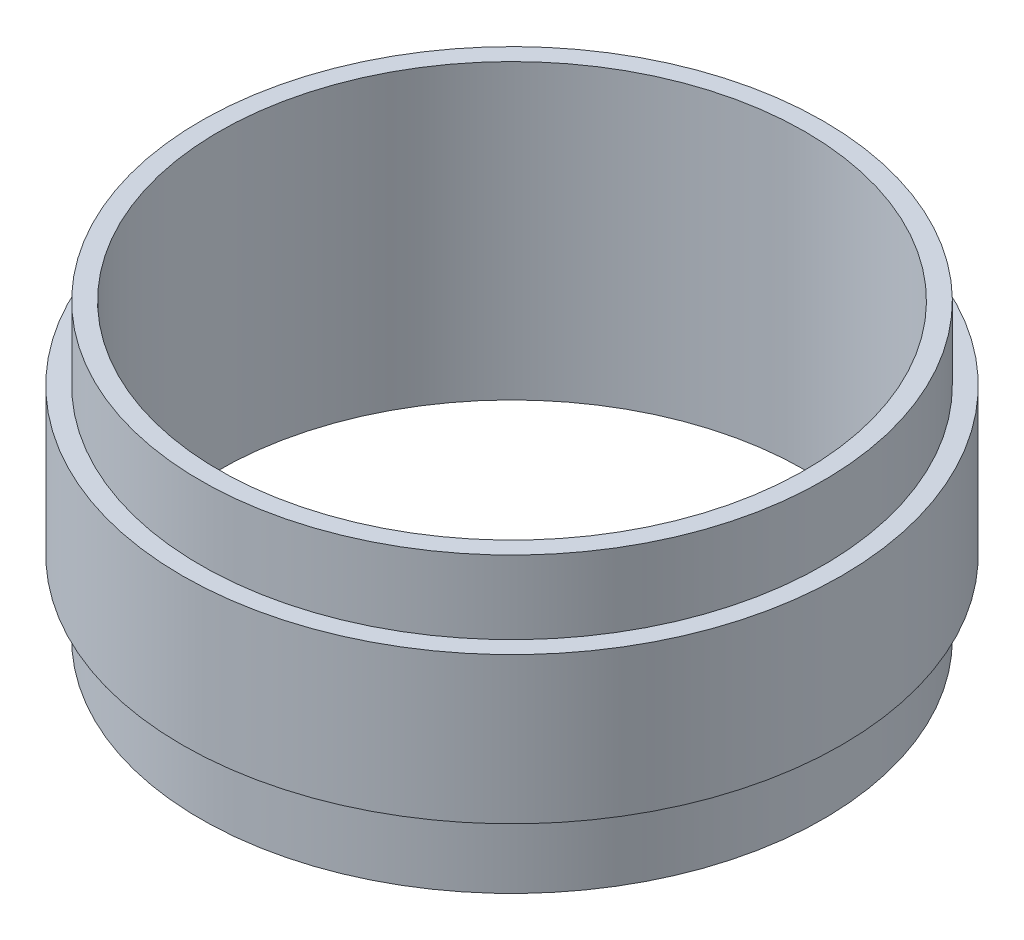
ISO-10303-21;
HEADER;
FILE_DESCRIPTION(('STEP AP214'),'2;1');
FILE_NAME('part.step','',(''),(''),'','','');
FILE_SCHEMA(('AUTOMOTIVE_DESIGN { 1 0 10303 214 1 1 1 1 }'));
ENDSEC;
DATA;
#1=APPLICATION_CONTEXT('core data for automotive mechanical design processes');
#2=APPLICATION_PROTOCOL_DEFINITION('international standard','automotive_design',2000,#1);
#3=PRODUCT_CONTEXT('',#1,'mechanical');
#4=PRODUCT('Part','Part','',(#3));
#5=PRODUCT_RELATED_PRODUCT_CATEGORY('part','',(#4));
#6=PRODUCT_DEFINITION_FORMATION('','',#4);
#7=PRODUCT_DEFINITION_CONTEXT('part definition',#1,'design');
#8=PRODUCT_DEFINITION('design','',#6,#7);
#9=PRODUCT_DEFINITION_SHAPE('','',#8);
#10=(LENGTH_UNIT() NAMED_UNIT(*) SI_UNIT(.MILLI.,.METRE.));
#11=(NAMED_UNIT(*) PLANE_ANGLE_UNIT() SI_UNIT($,.RADIAN.));
#12=(NAMED_UNIT(*) SI_UNIT($,.STERADIAN.) SOLID_ANGLE_UNIT());
#13=UNCERTAINTY_MEASURE_WITH_UNIT(LENGTH_MEASURE(1.E-05),#10,'distance_accuracy_value','');
#14=(GEOMETRIC_REPRESENTATION_CONTEXT(3) GLOBAL_UNCERTAINTY_ASSIGNED_CONTEXT((#13)) GLOBAL_UNIT_ASSIGNED_CONTEXT((#10,
#11,#12)) REPRESENTATION_CONTEXT('',''));
#15=CARTESIAN_POINT('',(0.,0.,0.));
#16=DIRECTION('',(0.,0.,1.));
#17=DIRECTION('',(1.,0.,0.));
#18=AXIS2_PLACEMENT_3D('',#15,#16,#17);
#19=CARTESIAN_POINT('',(8.5,-80.,0.));
#20=DIRECTION('',(0.,-1.,0.));
#21=DIRECTION('',(0.,0.,-1.));
#22=AXIS2_PLACEMENT_3D('',#19,#20,#21);
#23=PLANE('',#22);
#24=CARTESIAN_POINT('',(0.,-80.,0.));
#25=DIRECTION('',(0.,-1.,0.));
#26=DIRECTION('',(0.,0.,-1.));
#27=AXIS2_PLACEMENT_3D('',#24,#25,#26);
#28=CIRCLE('',#27,8.5);
#29=CARTESIAN_POINT('',(0.,-80.,-8.5));
#30=VERTEX_POINT('',#29);
#31=EDGE_CURVE('E59',#30,#30,#28,.T.);
#32=ORIENTED_EDGE('',*,*,#31,.T.);
#33=EDGE_LOOP('',(#32));
#34=FACE_BOUND('',#33,.T.);
#35=CARTESIAN_POINT('',(0.,-80.,0.));
#36=DIRECTION('',(0.,-1.,0.));
#37=DIRECTION('',(0.,0.,-1.));
#38=AXIS2_PLACEMENT_3D('',#35,#36,#37);
#39=CIRCLE('',#38,8.);
#40=CARTESIAN_POINT('',(0.,-80.,-8.));
#41=VERTEX_POINT('',#40);
#42=EDGE_CURVE('E10',#41,#41,#39,.T.);
#43=ORIENTED_EDGE('',*,*,#42,.F.);
#44=EDGE_LOOP('',(#43));
#45=FACE_BOUND('',#44,.T.);
#46=ADVANCED_FACE('F31',(#34,#45),#23,.T.);
#47=CARTESIAN_POINT('',(0.,-500.,0.));
#48=DIRECTION('',(0.,-1.,0.));
#49=DIRECTION('',(0.,0.,-1.));
#50=AXIS2_PLACEMENT_3D('',#47,#48,#49);
#51=CYLINDRICAL_SURFACE('',#50,8.);
#52=ORIENTED_EDGE('',*,*,#42,.T.);
#53=EDGE_LOOP('',(#52));
#54=FACE_BOUND('',#53,.T.);
#55=CARTESIAN_POINT('',(0.,-72.,0.));
#56=DIRECTION('',(0.,-1.,0.));
#57=DIRECTION('',(0.,0.,-1.));
#58=AXIS2_PLACEMENT_3D('',#55,#56,#57);
#59=CIRCLE('',#58,8.);
#60=CARTESIAN_POINT('',(0.,-72.,-8.));
#61=VERTEX_POINT('',#60);
#62=EDGE_CURVE('E37',#61,#61,#59,.T.);
#63=ORIENTED_EDGE('',*,*,#62,.F.);
#64=EDGE_LOOP('',(#63));
#65=FACE_BOUND('',#64,.T.);
#66=ADVANCED_FACE('F77',(#54,#65),#51,.F.);
#67=CARTESIAN_POINT('',(8.,-72.,0.));
#68=DIRECTION('',(0.,1.,0.));
#69=DIRECTION('',(0.,0.,1.));
#70=AXIS2_PLACEMENT_3D('',#67,#68,#69);
#71=PLANE('',#70);
#72=ORIENTED_EDGE('',*,*,#62,.T.);
#73=EDGE_LOOP('',(#72));
#74=FACE_BOUND('',#73,.T.);
#75=CARTESIAN_POINT('',(0.,-72.,0.));
#76=DIRECTION('',(0.,-1.,0.));
#77=DIRECTION('',(0.,0.,-1.));
#78=AXIS2_PLACEMENT_3D('',#75,#76,#77);
#79=CIRCLE('',#78,8.5);
#80=CARTESIAN_POINT('',(0.,-72.,-8.5));
#81=VERTEX_POINT('',#80);
#82=EDGE_CURVE('E41',#81,#81,#79,.T.);
#83=ORIENTED_EDGE('',*,*,#82,.F.);
#84=EDGE_LOOP('',(#83));
#85=FACE_BOUND('',#84,.T.);
#86=ADVANCED_FACE('F81',(#74,#85),#71,.T.);
#87=CARTESIAN_POINT('',(0.,-500.,0.));
#88=DIRECTION('',(0.,-1.,0.));
#89=DIRECTION('',(0.,0.,-1.));
#90=AXIS2_PLACEMENT_3D('',#87,#88,#89);
#91=CYLINDRICAL_SURFACE('',#90,8.5);
#92=ORIENTED_EDGE('',*,*,#82,.T.);
#93=EDGE_LOOP('',(#92));
#94=FACE_BOUND('',#93,.T.);
#95=CARTESIAN_POINT('',(0.,-74.,0.));
#96=DIRECTION('',(0.,-1.,0.));
#97=DIRECTION('',(0.,0.,-1.));
#98=AXIS2_PLACEMENT_3D('',#95,#96,#97);
#99=CIRCLE('',#98,8.5);
#100=CARTESIAN_POINT('',(0.,-74.,-8.5));
#101=VERTEX_POINT('',#100);
#102=EDGE_CURVE('E45',#101,#101,#99,.T.);
#103=ORIENTED_EDGE('',*,*,#102,.F.);
#104=EDGE_LOOP('',(#103));
#105=FACE_BOUND('',#104,.T.);
#106=ADVANCED_FACE('F85',(#94,#105),#91,.T.);
#107=CARTESIAN_POINT('',(8.5,-74.,0.));
#108=DIRECTION('',(0.,1.,0.));
#109=DIRECTION('',(0.,0.,1.));
#110=AXIS2_PLACEMENT_3D('',#107,#108,#109);
#111=PLANE('',#110);
#112=ORIENTED_EDGE('',*,*,#102,.T.);
#113=EDGE_LOOP('',(#112));
#114=FACE_BOUND('',#113,.T.);
#115=CARTESIAN_POINT('',(0.,-74.,0.));
#116=DIRECTION('',(0.,-1.,0.));
#117=DIRECTION('',(0.,0.,-1.));
#118=AXIS2_PLACEMENT_3D('',#115,#116,#117);
#119=CIRCLE('',#118,9.);
#120=CARTESIAN_POINT('',(0.,-74.,-9.));
#121=VERTEX_POINT('',#120);
#122=EDGE_CURVE('E50',#121,#121,#119,.T.);
#123=ORIENTED_EDGE('',*,*,#122,.F.);
#124=EDGE_LOOP('',(#123));
#125=FACE_BOUND('',#124,.T.);
#126=ADVANCED_FACE('F91',(#114,#125),#111,.T.);
#127=CARTESIAN_POINT('',(0.,-500.,0.));
#128=DIRECTION('',(0.,-1.,0.));
#129=DIRECTION('',(0.,0.,-1.));
#130=AXIS2_PLACEMENT_3D('',#127,#128,#129);
#131=CYLINDRICAL_SURFACE('',#130,9.);
#132=ORIENTED_EDGE('',*,*,#122,.T.);
#133=EDGE_LOOP('',(#132));
#134=FACE_BOUND('',#133,.T.);
#135=CARTESIAN_POINT('',(0.,-78.,0.));
#136=DIRECTION('',(0.,-1.,0.));
#137=DIRECTION('',(0.,0.,-1.));
#138=AXIS2_PLACEMENT_3D('',#135,#136,#137);
#139=CIRCLE('',#138,9.);
#140=CARTESIAN_POINT('',(0.,-78.,-9.));
#141=VERTEX_POINT('',#140);
#142=EDGE_CURVE('E53',#141,#141,#139,.T.);
#143=ORIENTED_EDGE('',*,*,#142,.F.);
#144=EDGE_LOOP('',(#143));
#145=FACE_BOUND('',#144,.T.);
#146=ADVANCED_FACE('F73',(#134,#145),#131,.T.);
#147=CARTESIAN_POINT('',(9.,-78.,0.));
#148=DIRECTION('',(0.,-1.,0.));
#149=DIRECTION('',(0.,0.,-1.));
#150=AXIS2_PLACEMENT_3D('',#147,#148,#149);
#151=PLANE('',#150);
#152=ORIENTED_EDGE('',*,*,#142,.T.);
#153=EDGE_LOOP('',(#152));
#154=FACE_BOUND('',#153,.T.);
#155=CARTESIAN_POINT('',(0.,-78.,0.));
#156=DIRECTION('',(0.,-1.,0.));
#157=DIRECTION('',(0.,0.,-1.));
#158=AXIS2_PLACEMENT_3D('',#155,#156,#157);
#159=CIRCLE('',#158,8.5);
#160=CARTESIAN_POINT('',(0.,-78.,-8.5));
#161=VERTEX_POINT('',#160);
#162=EDGE_CURVE('E56',#161,#161,#159,.T.);
#163=ORIENTED_EDGE('',*,*,#162,.F.);
#164=EDGE_LOOP('',(#163));
#165=FACE_BOUND('',#164,.T.);
#166=ADVANCED_FACE('F67',(#154,#165),#151,.T.);
#167=CARTESIAN_POINT('',(0.,-500.,0.));
#168=DIRECTION('',(0.,-1.,0.));
#169=DIRECTION('',(0.,0.,-1.));
#170=AXIS2_PLACEMENT_3D('',#167,#168,#169);
#171=CYLINDRICAL_SURFACE('',#170,8.5);
#172=ORIENTED_EDGE('',*,*,#162,.T.);
#173=EDGE_LOOP('',(#172));
#174=FACE_BOUND('',#173,.T.);
#175=ORIENTED_EDGE('',*,*,#31,.F.);
#176=EDGE_LOOP('',(#175));
#177=FACE_BOUND('',#176,.T.);
#178=ADVANCED_FACE('F65',(#174,#177),#171,.T.);
#179=CLOSED_SHELL('',(#46,#66,#86,#106,#126,#146,#166,#178));
#180=MANIFOLD_SOLID_BREP('B2',#179);
#181=ADVANCED_BREP_SHAPE_REPRESENTATION('',(#18,#180),#14);
#182=SHAPE_DEFINITION_REPRESENTATION(#9,#181);
ENDSEC;
END-ISO-10303-21;
